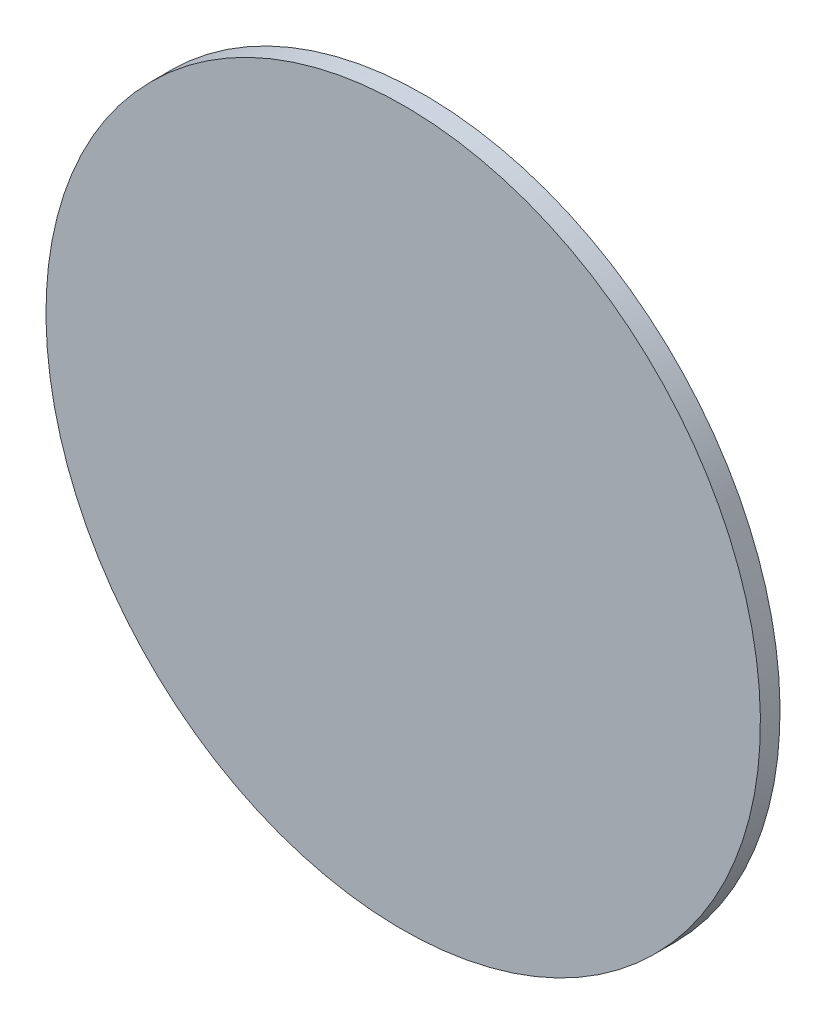
ISO-10303-21;
HEADER;
FILE_DESCRIPTION(('STEP AP214'),'2;1');
FILE_NAME('part.step','',(''),(''),'','','');
FILE_SCHEMA(('AUTOMOTIVE_DESIGN { 1 0 10303 214 1 1 1 1 }'));
ENDSEC;
DATA;
#1=APPLICATION_CONTEXT('core data for automotive mechanical design processes');
#2=APPLICATION_PROTOCOL_DEFINITION('international standard','automotive_design',2000,#1);
#3=PRODUCT_CONTEXT('',#1,'mechanical');
#4=PRODUCT('Part','Part','',(#3));
#5=PRODUCT_RELATED_PRODUCT_CATEGORY('part','',(#4));
#6=PRODUCT_DEFINITION_FORMATION('','',#4);
#7=PRODUCT_DEFINITION_CONTEXT('part definition',#1,'design');
#8=PRODUCT_DEFINITION('design','',#6,#7);
#9=PRODUCT_DEFINITION_SHAPE('','',#8);
#10=(LENGTH_UNIT() NAMED_UNIT(*) SI_UNIT(.MILLI.,.METRE.));
#11=(NAMED_UNIT(*) PLANE_ANGLE_UNIT() SI_UNIT($,.RADIAN.));
#12=(NAMED_UNIT(*) SI_UNIT($,.STERADIAN.) SOLID_ANGLE_UNIT());
#13=UNCERTAINTY_MEASURE_WITH_UNIT(LENGTH_MEASURE(1.E-05),#10,'distance_accuracy_value','');
#14=(GEOMETRIC_REPRESENTATION_CONTEXT(3) GLOBAL_UNCERTAINTY_ASSIGNED_CONTEXT((#13)) GLOBAL_UNIT_ASSIGNED_CONTEXT((#10,
#11,#12)) REPRESENTATION_CONTEXT('',''));
#15=CARTESIAN_POINT('',(0.,0.,0.));
#16=DIRECTION('',(0.,0.,1.));
#17=DIRECTION('',(1.,0.,0.));
#18=AXIS2_PLACEMENT_3D('',#15,#16,#17);
#19=CARTESIAN_POINT('',(110.324012,-135.707012,1.635));
#20=DIRECTION('',(0.,0.,1.));
#21=DIRECTION('',(1.,0.,0.));
#22=AXIS2_PLACEMENT_3D('',#19,#20,#21);
#23=PLANE('',#22);
#24=DIRECTION('',(0.707106781188048,0.707106781185048,0.));
#25=VECTOR('',#24,1.);
#26=CARTESIAN_POINT('',(110.324012,-135.707012,1.635));
#27=LINE('',#26,#25);
#28=CARTESIAN_POINT('',(110.324012,-135.707012,1.635));
#29=VERTEX_POINT('',#28);
#30=CARTESIAN_POINT('',(110.328012,-135.703012,1.635));
#31=VERTEX_POINT('',#30);
#32=EDGE_CURVE('E82',#29,#31,#27,.T.);
#33=ORIENTED_EDGE('',*,*,#32,.T.);
#34=CARTESIAN_POINT('',(109.8789995,-135.2539995,1.635));
#35=DIRECTION('',(0.,0.,1.));
#36=DIRECTION('',(0.707106781186548,-0.707106781186548,0.));
#37=AXIS2_PLACEMENT_3D('',#34,#35,#36);
#38=CIRCLE('',#37,0.634999567175);
#39=CARTESIAN_POINT('',(109.429987,-134.804987,1.635));
#40=VERTEX_POINT('',#39);
#41=EDGE_CURVE('E106',#31,#40,#38,.T.);
#42=ORIENTED_EDGE('',*,*,#41,.T.);
#43=DIRECTION('',(-0.707106781186548,-0.707106781186548,0.));
#44=VECTOR('',#43,1.);
#45=CARTESIAN_POINT('',(109.429987,-134.804987,1.635));
#46=LINE('',#45,#44);
#47=CARTESIAN_POINT('',(109.425987,-134.808987,1.635));
#48=VERTEX_POINT('',#47);
#49=EDGE_CURVE('E75',#40,#48,#46,.T.);
#50=ORIENTED_EDGE('',*,*,#49,.T.);
#51=CARTESIAN_POINT('',(109.8749995,-135.2579995,1.635));
#52=DIRECTION('',(0.,0.,1.));
#53=DIRECTION('',(-0.707106781186548,0.707106781186548,0.));
#54=AXIS2_PLACEMENT_3D('',#51,#52,#53);
#55=CIRCLE('',#54,0.634999567175);
#56=EDGE_CURVE('E11',#48,#29,#55,.T.);
#57=ORIENTED_EDGE('',*,*,#56,.T.);
#58=EDGE_LOOP('',(#33,#42,#50,#57));
#59=FACE_BOUND('',#58,.T.);
#60=ADVANCED_FACE('F17',(#59),#23,.T.);
#61=CARTESIAN_POINT('',(110.324012,-135.707012,1.6));
#62=DIRECTION('',(0.,0.,1.));
#63=DIRECTION('',(1.,0.,0.));
#64=AXIS2_PLACEMENT_3D('',#61,#62,#63);
#65=PLANE('',#64);
#66=CARTESIAN_POINT('',(109.8749995,-135.2579995,1.6));
#67=DIRECTION('',(0.,0.,1.));
#68=DIRECTION('',(-0.707106781186548,0.707106781186548,0.));
#69=AXIS2_PLACEMENT_3D('',#66,#67,#68);
#70=CIRCLE('',#69,0.634999567175);
#71=CARTESIAN_POINT('',(109.425987,-134.808987,1.6));
#72=VERTEX_POINT('',#71);
#73=CARTESIAN_POINT('',(110.324012,-135.707012,1.6));
#74=VERTEX_POINT('',#73);
#75=EDGE_CURVE('E20',#72,#74,#70,.T.);
#76=ORIENTED_EDGE('',*,*,#75,.F.);
#77=DIRECTION('',(-0.707106781186548,-0.707106781186548,0.));
#78=VECTOR('',#77,1.);
#79=CARTESIAN_POINT('',(109.429987,-134.804987,1.6));
#80=LINE('',#79,#78);
#81=CARTESIAN_POINT('',(109.429987,-134.804987,1.6));
#82=VERTEX_POINT('',#81);
#83=EDGE_CURVE('E110',#82,#72,#80,.T.);
#84=ORIENTED_EDGE('',*,*,#83,.F.);
#85=CARTESIAN_POINT('',(109.8789995,-135.2539995,1.6));
#86=DIRECTION('',(0.,0.,1.));
#87=DIRECTION('',(0.707106781186548,-0.707106781186548,0.));
#88=AXIS2_PLACEMENT_3D('',#85,#86,#87);
#89=CIRCLE('',#88,0.634999567175);
#90=CARTESIAN_POINT('',(110.328012,-135.703012,1.6));
#91=VERTEX_POINT('',#90);
#92=EDGE_CURVE('E84',#91,#82,#89,.T.);
#93=ORIENTED_EDGE('',*,*,#92,.F.);
#94=DIRECTION('',(0.707106781188048,0.707106781185048,0.));
#95=VECTOR('',#94,1.);
#96=CARTESIAN_POINT('',(110.324012,-135.707012,1.6));
#97=LINE('',#96,#95);
#98=EDGE_CURVE('E80',#74,#91,#97,.T.);
#99=ORIENTED_EDGE('',*,*,#98,.F.);
#100=EDGE_LOOP('',(#76,#84,#93,#99));
#101=FACE_BOUND('',#100,.T.);
#102=ADVANCED_FACE('F86',(#101),#65,.F.);
#103=CARTESIAN_POINT('',(109.8749995,-135.2579995,1.6));
#104=DIRECTION('',(0.,0.,-1.));
#105=DIRECTION('',(-0.707106781186548,0.707106781186548,0.));
#106=AXIS2_PLACEMENT_3D('',#103,#104,#105);
#107=CYLINDRICAL_SURFACE('',#106,0.634999567175);
#108=ORIENTED_EDGE('',*,*,#75,.T.);
#109=DIRECTION('',(0.,0.,1.));
#110=VECTOR('',#109,1.);
#111=CARTESIAN_POINT('',(110.324012,-135.707012,1.6));
#112=LINE('',#111,#110);
#113=EDGE_CURVE('E69',#74,#29,#112,.T.);
#114=ORIENTED_EDGE('',*,*,#113,.T.);
#115=ORIENTED_EDGE('',*,*,#56,.F.);
#116=DIRECTION('',(0.,0.,1.));
#117=VECTOR('',#116,1.);
#118=CARTESIAN_POINT('',(109.425987,-134.808987,1.6));
#119=LINE('',#118,#117);
#120=EDGE_CURVE('E72',#72,#48,#119,.T.);
#121=ORIENTED_EDGE('',*,*,#120,.F.);
#122=EDGE_LOOP('',(#108,#114,#115,#121));
#123=FACE_BOUND('',#122,.T.);
#124=ADVANCED_FACE('F68',(#123),#107,.T.);
#125=CARTESIAN_POINT('',(109.429987,-134.804987,1.6));
#126=DIRECTION('',(0.707106781186548,-0.707106781186548,0.));
#127=DIRECTION('',(0.,0.,-1.));
#128=AXIS2_PLACEMENT_3D('',#125,#126,#127);
#129=PLANE('',#128);
#130=ORIENTED_EDGE('',*,*,#83,.T.);
#131=ORIENTED_EDGE('',*,*,#120,.T.);
#132=ORIENTED_EDGE('',*,*,#49,.F.);
#133=DIRECTION('',(0.,0.,1.));
#134=VECTOR('',#133,1.);
#135=CARTESIAN_POINT('',(109.429987,-134.804987,1.6));
#136=LINE('',#135,#134);
#137=EDGE_CURVE('E102',#82,#40,#136,.T.);
#138=ORIENTED_EDGE('',*,*,#137,.F.);
#139=EDGE_LOOP('',(#130,#131,#132,#138));
#140=FACE_BOUND('',#139,.T.);
#141=ADVANCED_FACE('F118',(#140),#129,.F.);
#142=CARTESIAN_POINT('',(109.8789995,-135.2539995,1.6));
#143=DIRECTION('',(0.,0.,-1.));
#144=DIRECTION('',(0.707106781186548,-0.707106781186548,0.));
#145=AXIS2_PLACEMENT_3D('',#142,#143,#144);
#146=CYLINDRICAL_SURFACE('',#145,0.634999567175);
#147=ORIENTED_EDGE('',*,*,#92,.T.);
#148=ORIENTED_EDGE('',*,*,#137,.T.);
#149=ORIENTED_EDGE('',*,*,#41,.F.);
#150=DIRECTION('',(0.,0.,1.));
#151=VECTOR('',#150,1.);
#152=CARTESIAN_POINT('',(110.328012,-135.703012,1.6));
#153=LINE('',#152,#151);
#154=EDGE_CURVE('E90',#91,#31,#153,.T.);
#155=ORIENTED_EDGE('',*,*,#154,.F.);
#156=EDGE_LOOP('',(#147,#148,#149,#155));
#157=FACE_BOUND('',#156,.T.);
#158=ADVANCED_FACE('F121',(#157),#146,.T.);
#159=CARTESIAN_POINT('',(110.324012,-135.707012,1.6));
#160=DIRECTION('',(-0.707106781185048,0.707106781188048,0.));
#161=DIRECTION('',(0.,0.,1.));
#162=AXIS2_PLACEMENT_3D('',#159,#160,#161);
#163=PLANE('',#162);
#164=ORIENTED_EDGE('',*,*,#98,.T.);
#165=ORIENTED_EDGE('',*,*,#154,.T.);
#166=ORIENTED_EDGE('',*,*,#32,.F.);
#167=ORIENTED_EDGE('',*,*,#113,.F.);
#168=EDGE_LOOP('',(#164,#165,#166,#167));
#169=FACE_BOUND('',#168,.T.);
#170=ADVANCED_FACE('F78',(#169),#163,.F.);
#171=CLOSED_SHELL('',(#60,#102,#124,#141,#158,#170));
#172=MANIFOLD_SOLID_BREP('B1',#171);
#173=ADVANCED_BREP_SHAPE_REPRESENTATION('',(#18,#172),#14);
#174=SHAPE_DEFINITION_REPRESENTATION(#9,#173);
ENDSEC;
END-ISO-10303-21;
